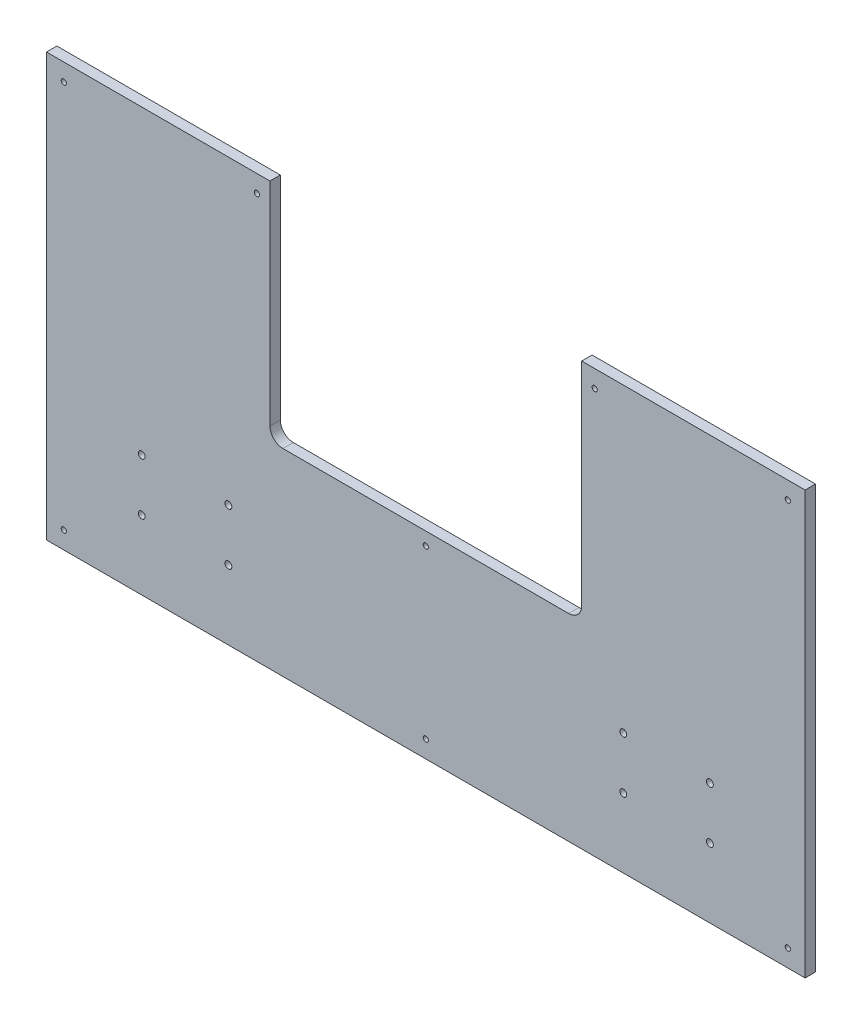
ISO-10303-21;
HEADER;
FILE_DESCRIPTION(('STEP AP214'),'2;1');
FILE_NAME('part.step','',(''),(''),'','','');
FILE_SCHEMA(('AUTOMOTIVE_DESIGN { 1 0 10303 214 1 1 1 1 }'));
ENDSEC;
DATA;
#1=APPLICATION_CONTEXT('core data for automotive mechanical design processes');
#2=APPLICATION_PROTOCOL_DEFINITION('international standard','automotive_design',2000,#1);
#3=PRODUCT_CONTEXT('',#1,'mechanical');
#4=PRODUCT('Part','Part','',(#3));
#5=PRODUCT_RELATED_PRODUCT_CATEGORY('part','',(#4));
#6=PRODUCT_DEFINITION_FORMATION('','',#4);
#7=PRODUCT_DEFINITION_CONTEXT('part definition',#1,'design');
#8=PRODUCT_DEFINITION('design','',#6,#7);
#9=PRODUCT_DEFINITION_SHAPE('','',#8);
#10=(LENGTH_UNIT() NAMED_UNIT(*) SI_UNIT(.MILLI.,.METRE.));
#11=(NAMED_UNIT(*) PLANE_ANGLE_UNIT() SI_UNIT($,.RADIAN.));
#12=(NAMED_UNIT(*) SI_UNIT($,.STERADIAN.) SOLID_ANGLE_UNIT());
#13=UNCERTAINTY_MEASURE_WITH_UNIT(LENGTH_MEASURE(1.E-05),#10,'distance_accuracy_value','');
#14=(GEOMETRIC_REPRESENTATION_CONTEXT(3) GLOBAL_UNCERTAINTY_ASSIGNED_CONTEXT((#13)) GLOBAL_UNIT_ASSIGNED_CONTEXT((#10,
#11,#12)) REPRESENTATION_CONTEXT('',''));
#15=CARTESIAN_POINT('',(0.,0.,0.));
#16=DIRECTION('',(0.,0.,1.));
#17=DIRECTION('',(1.,0.,0.));
#18=AXIS2_PLACEMENT_3D('',#15,#16,#17);
#19=CARTESIAN_POINT('',(136.5,121.5,6.));
#20=DIRECTION('',(0.,0.,1.));
#21=DIRECTION('',(1.,0.,0.));
#22=AXIS2_PLACEMENT_3D('',#19,#20,#21);
#23=PLANE('',#22);
#24=CARTESIAN_POINT('',(55.,40.,6.));
#25=DIRECTION('',(0.,0.,1.));
#26=DIRECTION('',(1.,0.,0.));
#27=AXIS2_PLACEMENT_3D('',#24,#25,#26);
#28=CIRCLE('',#27,2.);
#29=CARTESIAN_POINT('',(57.,40.,6.));
#30=VERTEX_POINT('',#29);
#31=EDGE_CURVE('E353',#30,#30,#28,.T.);
#32=ORIENTED_EDGE('',*,*,#31,.F.);
#33=EDGE_LOOP('',(#32));
#34=FACE_BOUND('',#33,.T.);
#35=CARTESIAN_POINT('',(55.,70.,6.));
#36=DIRECTION('',(0.,0.,1.));
#37=DIRECTION('',(1.,0.,0.));
#38=AXIS2_PLACEMENT_3D('',#35,#36,#37);
#39=CIRCLE('',#38,2.);
#40=CARTESIAN_POINT('',(57.,70.,6.));
#41=VERTEX_POINT('',#40);
#42=EDGE_CURVE('E337',#41,#41,#39,.T.);
#43=ORIENTED_EDGE('',*,*,#42,.F.);
#44=EDGE_LOOP('',(#43));
#45=FACE_BOUND('',#44,.T.);
#46=CARTESIAN_POINT('',(383.,40.,6.));
#47=DIRECTION('',(0.,0.,1.));
#48=DIRECTION('',(1.,0.,0.));
#49=AXIS2_PLACEMENT_3D('',#46,#47,#48);
#50=CIRCLE('',#49,2.);
#51=CARTESIAN_POINT('',(385.,40.,6.));
#52=VERTEX_POINT('',#51);
#53=EDGE_CURVE('E321',#52,#52,#50,.T.);
#54=ORIENTED_EDGE('',*,*,#53,.F.);
#55=EDGE_LOOP('',(#54));
#56=FACE_BOUND('',#55,.T.);
#57=CARTESIAN_POINT('',(219.,106.5,6.));
#58=DIRECTION('',(0.,0.,1.));
#59=DIRECTION('',(1.,0.,0.));
#60=AXIS2_PLACEMENT_3D('',#57,#58,#59);
#61=CIRCLE('',#60,1.5);
#62=CARTESIAN_POINT('',(220.5,106.5,6.));
#63=VERTEX_POINT('',#62);
#64=EDGE_CURVE('E305',#63,#63,#61,.T.);
#65=ORIENTED_EDGE('',*,*,#64,.F.);
#66=EDGE_LOOP('',(#65));
#67=FACE_BOUND('',#66,.T.);
#68=CARTESIAN_POINT('',(428.,234.,6.));
#69=DIRECTION('',(0.,0.,1.));
#70=DIRECTION('',(1.,0.,0.));
#71=AXIS2_PLACEMENT_3D('',#68,#69,#70);
#72=CIRCLE('',#71,1.50000000000002);
#73=CARTESIAN_POINT('',(429.5,234.,6.));
#74=VERTEX_POINT('',#73);
#75=EDGE_CURVE('E289',#74,#74,#72,.T.);
#76=ORIENTED_EDGE('',*,*,#75,.F.);
#77=EDGE_LOOP('',(#76));
#78=FACE_BOUND('',#77,.T.);
#79=CARTESIAN_POINT('',(383.,70.,6.));
#80=DIRECTION('',(0.,0.,1.));
#81=DIRECTION('',(1.,0.,0.));
#82=AXIS2_PLACEMENT_3D('',#79,#80,#81);
#83=CIRCLE('',#82,2.);
#84=CARTESIAN_POINT('',(385.,70.,6.));
#85=VERTEX_POINT('',#84);
#86=EDGE_CURVE('E273',#85,#85,#83,.T.);
#87=ORIENTED_EDGE('',*,*,#86,.F.);
#88=EDGE_LOOP('',(#87));
#89=FACE_BOUND('',#88,.T.);
#90=CARTESIAN_POINT('',(121.5,234.,6.));
#91=DIRECTION('',(0.,0.,1.));
#92=DIRECTION('',(1.,0.,0.));
#93=AXIS2_PLACEMENT_3D('',#90,#91,#92);
#94=CIRCLE('',#93,1.5);
#95=CARTESIAN_POINT('',(123.,234.,6.));
#96=VERTEX_POINT('',#95);
#97=EDGE_CURVE('E257',#96,#96,#94,.T.);
#98=ORIENTED_EDGE('',*,*,#97,.F.);
#99=EDGE_LOOP('',(#98));
#100=FACE_BOUND('',#99,.T.);
#101=CARTESIAN_POINT('',(10.,10.,6.));
#102=DIRECTION('',(0.,0.,1.));
#103=DIRECTION('',(1.,0.,0.));
#104=AXIS2_PLACEMENT_3D('',#101,#102,#103);
#105=CIRCLE('',#104,1.5);
#106=CARTESIAN_POINT('',(11.5,10.,6.));
#107=VERTEX_POINT('',#106);
#108=EDGE_CURVE('E158',#107,#107,#105,.T.);
#109=ORIENTED_EDGE('',*,*,#108,.F.);
#110=EDGE_LOOP('',(#109));
#111=FACE_BOUND('',#110,.T.);
#112=DIRECTION('',(0.,-1.,0.));
#113=VECTOR('',#112,1.);
#114=CARTESIAN_POINT('',(0.,0.,6.));
#115=LINE('',#114,#113);
#116=CARTESIAN_POINT('',(0.,244.,6.));
#117=VERTEX_POINT('',#116);
#118=CARTESIAN_POINT('',(0.,0.,6.));
#119=VERTEX_POINT('',#118);
#120=EDGE_CURVE('E182',#117,#119,#115,.T.);
#121=ORIENTED_EDGE('',*,*,#120,.T.);
#122=DIRECTION('',(1.,0.,0.));
#123=VECTOR('',#122,1.);
#124=CARTESIAN_POINT('',(0.,0.,6.));
#125=LINE('',#124,#123);
#126=CARTESIAN_POINT('',(438.,0.,6.));
#127=VERTEX_POINT('',#126);
#128=EDGE_CURVE('E106',#119,#127,#125,.T.);
#129=ORIENTED_EDGE('',*,*,#128,.T.);
#130=DIRECTION('',(0.,1.,0.));
#131=VECTOR('',#130,1.);
#132=CARTESIAN_POINT('',(438.,0.,6.));
#133=LINE('',#132,#131);
#134=CARTESIAN_POINT('',(438.,244.,6.));
#135=VERTEX_POINT('',#134);
#136=EDGE_CURVE('E211',#127,#135,#133,.T.);
#137=ORIENTED_EDGE('',*,*,#136,.T.);
#138=DIRECTION('',(-1.,0.,0.));
#139=VECTOR('',#138,1.);
#140=CARTESIAN_POINT('',(309.,244.,6.));
#141=LINE('',#140,#139);
#142=CARTESIAN_POINT('',(309.,244.,6.));
#143=VERTEX_POINT('',#142);
#144=EDGE_CURVE('E231',#135,#143,#141,.T.);
#145=ORIENTED_EDGE('',*,*,#144,.T.);
#146=DIRECTION('',(0.,-1.,0.));
#147=VECTOR('',#146,1.);
#148=CARTESIAN_POINT('',(309.,121.5,6.));
#149=LINE('',#148,#147);
#150=CARTESIAN_POINT('',(309.,121.5,6.));
#151=VERTEX_POINT('',#150);
#152=EDGE_CURVE('E227',#143,#151,#149,.T.);
#153=ORIENTED_EDGE('',*,*,#152,.T.);
#154=CARTESIAN_POINT('',(301.5,121.5,6.));
#155=DIRECTION('',(0.,0.,-1.));
#156=DIRECTION('',(1.,0.,0.));
#157=AXIS2_PLACEMENT_3D('',#154,#155,#156);
#158=CIRCLE('',#157,7.5);
#159=CARTESIAN_POINT('',(301.5,114.,6.));
#160=VERTEX_POINT('',#159);
#161=EDGE_CURVE('E230',#151,#160,#158,.T.);
#162=ORIENTED_EDGE('',*,*,#161,.T.);
#163=DIRECTION('',(-1.,0.,0.));
#164=VECTOR('',#163,1.);
#165=CARTESIAN_POINT('',(136.5,114.,6.));
#166=LINE('',#165,#164);
#167=CARTESIAN_POINT('',(136.5,114.,6.));
#168=VERTEX_POINT('',#167);
#169=EDGE_CURVE('E131',#160,#168,#166,.T.);
#170=ORIENTED_EDGE('',*,*,#169,.T.);
#171=CARTESIAN_POINT('',(136.5,121.5,6.));
#172=DIRECTION('',(0.,0.,-1.));
#173=DIRECTION('',(1.,0.,0.));
#174=AXIS2_PLACEMENT_3D('',#171,#172,#173);
#175=CIRCLE('',#174,7.50000000000001);
#176=CARTESIAN_POINT('',(129.,121.5,6.));
#177=VERTEX_POINT('',#176);
#178=EDGE_CURVE('E125',#168,#177,#175,.T.);
#179=ORIENTED_EDGE('',*,*,#178,.T.);
#180=DIRECTION('',(0.,1.,0.));
#181=VECTOR('',#180,1.);
#182=CARTESIAN_POINT('',(129.,244.,6.));
#183=LINE('',#182,#181);
#184=CARTESIAN_POINT('',(129.,244.,6.));
#185=VERTEX_POINT('',#184);
#186=EDGE_CURVE('E129',#177,#185,#183,.T.);
#187=ORIENTED_EDGE('',*,*,#186,.T.);
#188=DIRECTION('',(-1.,0.,0.));
#189=VECTOR('',#188,1.);
#190=CARTESIAN_POINT('',(0.,244.,6.));
#191=LINE('',#190,#189);
#192=EDGE_CURVE('E57',#185,#117,#191,.T.);
#193=ORIENTED_EDGE('',*,*,#192,.T.);
#194=EDGE_LOOP('',(#121,#129,#137,#145,#153,#162,#170,#179,#187,#193));
#195=FACE_BOUND('',#194,.T.);
#196=CARTESIAN_POINT('',(10.,234.,6.));
#197=DIRECTION('',(0.,0.,1.));
#198=DIRECTION('',(1.,0.,0.));
#199=AXIS2_PLACEMENT_3D('',#196,#197,#198);
#200=CIRCLE('',#199,1.5);
#201=CARTESIAN_POINT('',(11.5,234.,6.));
#202=VERTEX_POINT('',#201);
#203=EDGE_CURVE('E249',#202,#202,#200,.T.);
#204=ORIENTED_EDGE('',*,*,#203,.F.);
#205=EDGE_LOOP('',(#204));
#206=FACE_BOUND('',#205,.T.);
#207=CARTESIAN_POINT('',(333.,70.,6.));
#208=DIRECTION('',(0.,0.,1.));
#209=DIRECTION('',(1.,0.,0.));
#210=AXIS2_PLACEMENT_3D('',#207,#208,#209);
#211=CIRCLE('',#210,2.);
#212=CARTESIAN_POINT('',(335.,70.,6.));
#213=VERTEX_POINT('',#212);
#214=EDGE_CURVE('E265',#213,#213,#211,.T.);
#215=ORIENTED_EDGE('',*,*,#214,.F.);
#216=EDGE_LOOP('',(#215));
#217=FACE_BOUND('',#216,.T.);
#218=CARTESIAN_POINT('',(316.5,234.,6.));
#219=DIRECTION('',(0.,0.,1.));
#220=DIRECTION('',(1.,0.,0.));
#221=AXIS2_PLACEMENT_3D('',#218,#219,#220);
#222=CIRCLE('',#221,1.50000000000002);
#223=CARTESIAN_POINT('',(318.,234.,6.));
#224=VERTEX_POINT('',#223);
#225=EDGE_CURVE('E281',#224,#224,#222,.T.);
#226=ORIENTED_EDGE('',*,*,#225,.F.);
#227=EDGE_LOOP('',(#226));
#228=FACE_BOUND('',#227,.T.);
#229=CARTESIAN_POINT('',(428.,10.,6.));
#230=DIRECTION('',(0.,0.,1.));
#231=DIRECTION('',(1.,0.,0.));
#232=AXIS2_PLACEMENT_3D('',#229,#230,#231);
#233=CIRCLE('',#232,1.50000000000002);
#234=CARTESIAN_POINT('',(429.5,10.,6.));
#235=VERTEX_POINT('',#234);
#236=EDGE_CURVE('E297',#235,#235,#233,.T.);
#237=ORIENTED_EDGE('',*,*,#236,.F.);
#238=EDGE_LOOP('',(#237));
#239=FACE_BOUND('',#238,.T.);
#240=CARTESIAN_POINT('',(219.,10.,6.));
#241=DIRECTION('',(0.,0.,1.));
#242=DIRECTION('',(1.,0.,0.));
#243=AXIS2_PLACEMENT_3D('',#240,#241,#242);
#244=CIRCLE('',#243,1.5);
#245=CARTESIAN_POINT('',(220.5,10.,6.));
#246=VERTEX_POINT('',#245);
#247=EDGE_CURVE('E313',#246,#246,#244,.T.);
#248=ORIENTED_EDGE('',*,*,#247,.F.);
#249=EDGE_LOOP('',(#248));
#250=FACE_BOUND('',#249,.T.);
#251=CARTESIAN_POINT('',(333.,40.,6.));
#252=DIRECTION('',(0.,0.,1.));
#253=DIRECTION('',(1.,0.,0.));
#254=AXIS2_PLACEMENT_3D('',#251,#252,#253);
#255=CIRCLE('',#254,2.);
#256=CARTESIAN_POINT('',(335.,40.,6.));
#257=VERTEX_POINT('',#256);
#258=EDGE_CURVE('E329',#257,#257,#255,.T.);
#259=ORIENTED_EDGE('',*,*,#258,.F.);
#260=EDGE_LOOP('',(#259));
#261=FACE_BOUND('',#260,.T.);
#262=CARTESIAN_POINT('',(105.,70.,6.));
#263=DIRECTION('',(0.,0.,1.));
#264=DIRECTION('',(1.,0.,0.));
#265=AXIS2_PLACEMENT_3D('',#262,#263,#264);
#266=CIRCLE('',#265,2.);
#267=CARTESIAN_POINT('',(107.,70.,6.));
#268=VERTEX_POINT('',#267);
#269=EDGE_CURVE('E345',#268,#268,#266,.T.);
#270=ORIENTED_EDGE('',*,*,#269,.F.);
#271=EDGE_LOOP('',(#270));
#272=FACE_BOUND('',#271,.T.);
#273=CARTESIAN_POINT('',(105.,40.,6.));
#274=DIRECTION('',(0.,0.,1.));
#275=DIRECTION('',(1.,0.,0.));
#276=AXIS2_PLACEMENT_3D('',#273,#274,#275);
#277=CIRCLE('',#276,1.99999999999998);
#278=CARTESIAN_POINT('',(107.,40.,6.));
#279=VERTEX_POINT('',#278);
#280=EDGE_CURVE('E361',#279,#279,#277,.T.);
#281=ORIENTED_EDGE('',*,*,#280,.F.);
#282=EDGE_LOOP('',(#281));
#283=FACE_BOUND('',#282,.T.);
#284=ADVANCED_FACE('F39',(#34,#45,#56,#67,#78,#89,#100,#111,#195,#206,#217,#228,#239,#250,#261,
#272,#283),#23,.T.);
#285=CARTESIAN_POINT('',(136.5,121.5,0.));
#286=DIRECTION('',(0.,0.,1.));
#287=DIRECTION('',(1.,0.,0.));
#288=AXIS2_PLACEMENT_3D('',#285,#286,#287);
#289=PLANE('',#288);
#290=DIRECTION('',(0.,-1.,0.));
#291=VECTOR('',#290,1.);
#292=CARTESIAN_POINT('',(0.,0.,0.));
#293=LINE('',#292,#291);
#294=CARTESIAN_POINT('',(0.,244.,0.));
#295=VERTEX_POINT('',#294);
#296=CARTESIAN_POINT('',(0.,0.,0.));
#297=VERTEX_POINT('',#296);
#298=EDGE_CURVE('E153',#295,#297,#293,.T.);
#299=ORIENTED_EDGE('',*,*,#298,.F.);
#300=DIRECTION('',(-1.,0.,0.));
#301=VECTOR('',#300,1.);
#302=CARTESIAN_POINT('',(0.,244.,0.));
#303=LINE('',#302,#301);
#304=CARTESIAN_POINT('',(129.,244.,0.));
#305=VERTEX_POINT('',#304);
#306=EDGE_CURVE('E98',#305,#295,#303,.T.);
#307=ORIENTED_EDGE('',*,*,#306,.F.);
#308=DIRECTION('',(0.,1.,0.));
#309=VECTOR('',#308,1.);
#310=CARTESIAN_POINT('',(129.,244.,0.));
#311=LINE('',#310,#309);
#312=CARTESIAN_POINT('',(129.,121.5,0.));
#313=VERTEX_POINT('',#312);
#314=EDGE_CURVE('E92',#313,#305,#311,.T.);
#315=ORIENTED_EDGE('',*,*,#314,.F.);
#316=CARTESIAN_POINT('',(136.5,121.5,0.));
#317=DIRECTION('',(0.,0.,-1.));
#318=DIRECTION('',(1.,0.,0.));
#319=AXIS2_PLACEMENT_3D('',#316,#317,#318);
#320=CIRCLE('',#319,7.50000000000001);
#321=CARTESIAN_POINT('',(136.5,114.,0.));
#322=VERTEX_POINT('',#321);
#323=EDGE_CURVE('E140',#322,#313,#320,.T.);
#324=ORIENTED_EDGE('',*,*,#323,.F.);
#325=DIRECTION('',(-1.,0.,0.));
#326=VECTOR('',#325,1.);
#327=CARTESIAN_POINT('',(136.5,114.,0.));
#328=LINE('',#327,#326);
#329=CARTESIAN_POINT('',(301.5,114.,0.));
#330=VERTEX_POINT('',#329);
#331=EDGE_CURVE('E173',#330,#322,#328,.T.);
#332=ORIENTED_EDGE('',*,*,#331,.F.);
#333=CARTESIAN_POINT('',(301.5,121.5,0.));
#334=DIRECTION('',(0.,0.,-1.));
#335=DIRECTION('',(1.,0.,0.));
#336=AXIS2_PLACEMENT_3D('',#333,#334,#335);
#337=CIRCLE('',#336,7.5);
#338=CARTESIAN_POINT('',(309.,121.5,0.));
#339=VERTEX_POINT('',#338);
#340=EDGE_CURVE('E170',#339,#330,#337,.T.);
#341=ORIENTED_EDGE('',*,*,#340,.F.);
#342=DIRECTION('',(0.,-1.,0.));
#343=VECTOR('',#342,1.);
#344=CARTESIAN_POINT('',(309.,121.5,0.));
#345=LINE('',#344,#343);
#346=CARTESIAN_POINT('',(309.,244.,0.));
#347=VERTEX_POINT('',#346);
#348=EDGE_CURVE('E167',#347,#339,#345,.T.);
#349=ORIENTED_EDGE('',*,*,#348,.F.);
#350=DIRECTION('',(-1.,0.,0.));
#351=VECTOR('',#350,1.);
#352=CARTESIAN_POINT('',(309.,244.,0.));
#353=LINE('',#352,#351);
#354=CARTESIAN_POINT('',(438.,244.,0.));
#355=VERTEX_POINT('',#354);
#356=EDGE_CURVE('E164',#355,#347,#353,.T.);
#357=ORIENTED_EDGE('',*,*,#356,.F.);
#358=DIRECTION('',(0.,1.,0.));
#359=VECTOR('',#358,1.);
#360=CARTESIAN_POINT('',(438.,0.,0.));
#361=LINE('',#360,#359);
#362=CARTESIAN_POINT('',(438.,0.,0.));
#363=VERTEX_POINT('',#362);
#364=EDGE_CURVE('E161',#363,#355,#361,.T.);
#365=ORIENTED_EDGE('',*,*,#364,.F.);
#366=DIRECTION('',(1.,0.,0.));
#367=VECTOR('',#366,1.);
#368=CARTESIAN_POINT('',(0.,0.,0.));
#369=LINE('',#368,#367);
#370=EDGE_CURVE('E157',#297,#363,#369,.T.);
#371=ORIENTED_EDGE('',*,*,#370,.F.);
#372=EDGE_LOOP('',(#299,#307,#315,#324,#332,#341,#349,#357,#365,#371));
#373=FACE_BOUND('',#372,.T.);
#374=CARTESIAN_POINT('',(10.,10.,0.));
#375=DIRECTION('',(0.,0.,1.));
#376=DIRECTION('',(1.,0.,0.));
#377=AXIS2_PLACEMENT_3D('',#374,#375,#376);
#378=CIRCLE('',#377,1.5);
#379=CARTESIAN_POINT('',(11.5,10.,0.));
#380=VERTEX_POINT('',#379);
#381=EDGE_CURVE('E245',#380,#380,#378,.T.);
#382=ORIENTED_EDGE('',*,*,#381,.T.);
#383=EDGE_LOOP('',(#382));
#384=FACE_BOUND('',#383,.T.);
#385=CARTESIAN_POINT('',(10.,234.,0.));
#386=DIRECTION('',(0.,0.,1.));
#387=DIRECTION('',(1.,0.,0.));
#388=AXIS2_PLACEMENT_3D('',#385,#386,#387);
#389=CIRCLE('',#388,1.5);
#390=CARTESIAN_POINT('',(11.5,234.,0.));
#391=VERTEX_POINT('',#390);
#392=EDGE_CURVE('E253',#391,#391,#389,.T.);
#393=ORIENTED_EDGE('',*,*,#392,.T.);
#394=EDGE_LOOP('',(#393));
#395=FACE_BOUND('',#394,.T.);
#396=CARTESIAN_POINT('',(121.5,234.,0.));
#397=DIRECTION('',(0.,0.,1.));
#398=DIRECTION('',(1.,0.,0.));
#399=AXIS2_PLACEMENT_3D('',#396,#397,#398);
#400=CIRCLE('',#399,1.5);
#401=CARTESIAN_POINT('',(123.,234.,0.));
#402=VERTEX_POINT('',#401);
#403=EDGE_CURVE('E261',#402,#402,#400,.T.);
#404=ORIENTED_EDGE('',*,*,#403,.T.);
#405=EDGE_LOOP('',(#404));
#406=FACE_BOUND('',#405,.T.);
#407=CARTESIAN_POINT('',(333.,70.,0.));
#408=DIRECTION('',(0.,0.,1.));
#409=DIRECTION('',(1.,0.,0.));
#410=AXIS2_PLACEMENT_3D('',#407,#408,#409);
#411=CIRCLE('',#410,2.);
#412=CARTESIAN_POINT('',(335.,70.,0.));
#413=VERTEX_POINT('',#412);
#414=EDGE_CURVE('E269',#413,#413,#411,.T.);
#415=ORIENTED_EDGE('',*,*,#414,.T.);
#416=EDGE_LOOP('',(#415));
#417=FACE_BOUND('',#416,.T.);
#418=CARTESIAN_POINT('',(383.,70.,0.));
#419=DIRECTION('',(0.,0.,1.));
#420=DIRECTION('',(1.,0.,0.));
#421=AXIS2_PLACEMENT_3D('',#418,#419,#420);
#422=CIRCLE('',#421,2.);
#423=CARTESIAN_POINT('',(385.,70.,0.));
#424=VERTEX_POINT('',#423);
#425=EDGE_CURVE('E277',#424,#424,#422,.T.);
#426=ORIENTED_EDGE('',*,*,#425,.T.);
#427=EDGE_LOOP('',(#426));
#428=FACE_BOUND('',#427,.T.);
#429=CARTESIAN_POINT('',(316.5,234.,0.));
#430=DIRECTION('',(0.,0.,1.));
#431=DIRECTION('',(1.,0.,0.));
#432=AXIS2_PLACEMENT_3D('',#429,#430,#431);
#433=CIRCLE('',#432,1.50000000000002);
#434=CARTESIAN_POINT('',(318.,234.,0.));
#435=VERTEX_POINT('',#434);
#436=EDGE_CURVE('E285',#435,#435,#433,.T.);
#437=ORIENTED_EDGE('',*,*,#436,.T.);
#438=EDGE_LOOP('',(#437));
#439=FACE_BOUND('',#438,.T.);
#440=CARTESIAN_POINT('',(428.,234.,0.));
#441=DIRECTION('',(0.,0.,1.));
#442=DIRECTION('',(1.,0.,0.));
#443=AXIS2_PLACEMENT_3D('',#440,#441,#442);
#444=CIRCLE('',#443,1.50000000000002);
#445=CARTESIAN_POINT('',(429.5,234.,0.));
#446=VERTEX_POINT('',#445);
#447=EDGE_CURVE('E293',#446,#446,#444,.T.);
#448=ORIENTED_EDGE('',*,*,#447,.T.);
#449=EDGE_LOOP('',(#448));
#450=FACE_BOUND('',#449,.T.);
#451=CARTESIAN_POINT('',(428.,10.,0.));
#452=DIRECTION('',(0.,0.,1.));
#453=DIRECTION('',(1.,0.,0.));
#454=AXIS2_PLACEMENT_3D('',#451,#452,#453);
#455=CIRCLE('',#454,1.50000000000002);
#456=CARTESIAN_POINT('',(429.5,10.,0.));
#457=VERTEX_POINT('',#456);
#458=EDGE_CURVE('E301',#457,#457,#455,.T.);
#459=ORIENTED_EDGE('',*,*,#458,.T.);
#460=EDGE_LOOP('',(#459));
#461=FACE_BOUND('',#460,.T.);
#462=CARTESIAN_POINT('',(219.,106.5,0.));
#463=DIRECTION('',(0.,0.,1.));
#464=DIRECTION('',(1.,0.,0.));
#465=AXIS2_PLACEMENT_3D('',#462,#463,#464);
#466=CIRCLE('',#465,1.5);
#467=CARTESIAN_POINT('',(220.5,106.5,0.));
#468=VERTEX_POINT('',#467);
#469=EDGE_CURVE('E309',#468,#468,#466,.T.);
#470=ORIENTED_EDGE('',*,*,#469,.T.);
#471=EDGE_LOOP('',(#470));
#472=FACE_BOUND('',#471,.T.);
#473=CARTESIAN_POINT('',(219.,10.,0.));
#474=DIRECTION('',(0.,0.,1.));
#475=DIRECTION('',(1.,0.,0.));
#476=AXIS2_PLACEMENT_3D('',#473,#474,#475);
#477=CIRCLE('',#476,1.5);
#478=CARTESIAN_POINT('',(220.5,10.,0.));
#479=VERTEX_POINT('',#478);
#480=EDGE_CURVE('E317',#479,#479,#477,.T.);
#481=ORIENTED_EDGE('',*,*,#480,.T.);
#482=EDGE_LOOP('',(#481));
#483=FACE_BOUND('',#482,.T.);
#484=CARTESIAN_POINT('',(383.,40.,0.));
#485=DIRECTION('',(0.,0.,1.));
#486=DIRECTION('',(1.,0.,0.));
#487=AXIS2_PLACEMENT_3D('',#484,#485,#486);
#488=CIRCLE('',#487,2.);
#489=CARTESIAN_POINT('',(385.,40.,0.));
#490=VERTEX_POINT('',#489);
#491=EDGE_CURVE('E325',#490,#490,#488,.T.);
#492=ORIENTED_EDGE('',*,*,#491,.T.);
#493=EDGE_LOOP('',(#492));
#494=FACE_BOUND('',#493,.T.);
#495=CARTESIAN_POINT('',(333.,40.,0.));
#496=DIRECTION('',(0.,0.,1.));
#497=DIRECTION('',(1.,0.,0.));
#498=AXIS2_PLACEMENT_3D('',#495,#496,#497);
#499=CIRCLE('',#498,2.);
#500=CARTESIAN_POINT('',(335.,40.,0.));
#501=VERTEX_POINT('',#500);
#502=EDGE_CURVE('E333',#501,#501,#499,.T.);
#503=ORIENTED_EDGE('',*,*,#502,.T.);
#504=EDGE_LOOP('',(#503));
#505=FACE_BOUND('',#504,.T.);
#506=CARTESIAN_POINT('',(55.,70.,0.));
#507=DIRECTION('',(0.,0.,1.));
#508=DIRECTION('',(1.,0.,0.));
#509=AXIS2_PLACEMENT_3D('',#506,#507,#508);
#510=CIRCLE('',#509,2.);
#511=CARTESIAN_POINT('',(57.,70.,0.));
#512=VERTEX_POINT('',#511);
#513=EDGE_CURVE('E341',#512,#512,#510,.T.);
#514=ORIENTED_EDGE('',*,*,#513,.T.);
#515=EDGE_LOOP('',(#514));
#516=FACE_BOUND('',#515,.T.);
#517=CARTESIAN_POINT('',(105.,70.,0.));
#518=DIRECTION('',(0.,0.,1.));
#519=DIRECTION('',(1.,0.,0.));
#520=AXIS2_PLACEMENT_3D('',#517,#518,#519);
#521=CIRCLE('',#520,2.);
#522=CARTESIAN_POINT('',(107.,70.,0.));
#523=VERTEX_POINT('',#522);
#524=EDGE_CURVE('E349',#523,#523,#521,.T.);
#525=ORIENTED_EDGE('',*,*,#524,.T.);
#526=EDGE_LOOP('',(#525));
#527=FACE_BOUND('',#526,.T.);
#528=CARTESIAN_POINT('',(55.,40.,0.));
#529=DIRECTION('',(0.,0.,1.));
#530=DIRECTION('',(1.,0.,0.));
#531=AXIS2_PLACEMENT_3D('',#528,#529,#530);
#532=CIRCLE('',#531,2.);
#533=CARTESIAN_POINT('',(57.,40.,0.));
#534=VERTEX_POINT('',#533);
#535=EDGE_CURVE('E357',#534,#534,#532,.T.);
#536=ORIENTED_EDGE('',*,*,#535,.T.);
#537=EDGE_LOOP('',(#536));
#538=FACE_BOUND('',#537,.T.);
#539=CARTESIAN_POINT('',(105.,40.,0.));
#540=DIRECTION('',(0.,0.,1.));
#541=DIRECTION('',(1.,0.,0.));
#542=AXIS2_PLACEMENT_3D('',#539,#540,#541);
#543=CIRCLE('',#542,1.99999999999998);
#544=CARTESIAN_POINT('',(107.,40.,0.));
#545=VERTEX_POINT('',#544);
#546=EDGE_CURVE('E365',#545,#545,#543,.T.);
#547=ORIENTED_EDGE('',*,*,#546,.T.);
#548=EDGE_LOOP('',(#547));
#549=FACE_BOUND('',#548,.T.);
#550=ADVANCED_FACE('F215',(#373,#384,#395,#406,#417,#428,#439,#450,#461,#472,#483,#494,#505,
#516,#527,#538,#549),#289,.F.);
#551=CARTESIAN_POINT('',(0.,0.,6.));
#552=DIRECTION('',(1.,0.,0.));
#553=DIRECTION('',(0.,0.,-1.));
#554=AXIS2_PLACEMENT_3D('',#551,#552,#553);
#555=PLANE('',#554);
#556=ORIENTED_EDGE('',*,*,#298,.T.);
#557=DIRECTION('',(0.,0.,-1.));
#558=VECTOR('',#557,1.);
#559=CARTESIAN_POINT('',(0.,0.,6.));
#560=LINE('',#559,#558);
#561=EDGE_CURVE('E11',#119,#297,#560,.T.);
#562=ORIENTED_EDGE('',*,*,#561,.F.);
#563=ORIENTED_EDGE('',*,*,#120,.F.);
#564=DIRECTION('',(0.,0.,-1.));
#565=VECTOR('',#564,1.);
#566=CARTESIAN_POINT('',(0.,244.,6.));
#567=LINE('',#566,#565);
#568=EDGE_CURVE('E149',#117,#295,#567,.T.);
#569=ORIENTED_EDGE('',*,*,#568,.T.);
#570=EDGE_LOOP('',(#556,#562,#563,#569));
#571=FACE_BOUND('',#570,.T.);
#572=ADVANCED_FACE('F41',(#571),#555,.F.);
#573=CARTESIAN_POINT('',(0.,0.,6.));
#574=DIRECTION('',(0.,1.,0.));
#575=DIRECTION('',(0.,0.,1.));
#576=AXIS2_PLACEMENT_3D('',#573,#574,#575);
#577=PLANE('',#576);
#578=ORIENTED_EDGE('',*,*,#370,.T.);
#579=DIRECTION('',(0.,0.,-1.));
#580=VECTOR('',#579,1.);
#581=CARTESIAN_POINT('',(438.,0.,6.));
#582=LINE('',#581,#580);
#583=EDGE_CURVE('E49',#127,#363,#582,.T.);
#584=ORIENTED_EDGE('',*,*,#583,.F.);
#585=ORIENTED_EDGE('',*,*,#128,.F.);
#586=ORIENTED_EDGE('',*,*,#561,.T.);
#587=EDGE_LOOP('',(#578,#584,#585,#586));
#588=FACE_BOUND('',#587,.T.);
#589=ADVANCED_FACE('F409',(#588),#577,.F.);
#590=CARTESIAN_POINT('',(438.,0.,6.));
#591=DIRECTION('',(-1.,0.,0.));
#592=DIRECTION('',(0.,0.,1.));
#593=AXIS2_PLACEMENT_3D('',#590,#591,#592);
#594=PLANE('',#593);
#595=ORIENTED_EDGE('',*,*,#364,.T.);
#596=DIRECTION('',(0.,0.,-1.));
#597=VECTOR('',#596,1.);
#598=CARTESIAN_POINT('',(438.,244.,6.));
#599=LINE('',#598,#597);
#600=EDGE_CURVE('E201',#135,#355,#599,.T.);
#601=ORIENTED_EDGE('',*,*,#600,.F.);
#602=ORIENTED_EDGE('',*,*,#136,.F.);
#603=ORIENTED_EDGE('',*,*,#583,.T.);
#604=EDGE_LOOP('',(#595,#601,#602,#603));
#605=FACE_BOUND('',#604,.T.);
#606=ADVANCED_FACE('F209',(#605),#594,.F.);
#607=CARTESIAN_POINT('',(309.,244.,6.));
#608=DIRECTION('',(0.,-1.,0.));
#609=DIRECTION('',(1.,0.,0.));
#610=AXIS2_PLACEMENT_3D('',#607,#608,#609);
#611=PLANE('',#610);
#612=ORIENTED_EDGE('',*,*,#356,.T.);
#613=DIRECTION('',(0.,0.,-1.));
#614=VECTOR('',#613,1.);
#615=CARTESIAN_POINT('',(309.,244.,6.));
#616=LINE('',#615,#614);
#617=EDGE_CURVE('E197',#143,#347,#616,.T.);
#618=ORIENTED_EDGE('',*,*,#617,.F.);
#619=ORIENTED_EDGE('',*,*,#144,.F.);
#620=ORIENTED_EDGE('',*,*,#600,.T.);
#621=EDGE_LOOP('',(#612,#618,#619,#620));
#622=FACE_BOUND('',#621,.T.);
#623=ADVANCED_FACE('F221',(#622),#611,.F.);
#624=CARTESIAN_POINT('',(309.,121.5,6.));
#625=DIRECTION('',(1.,0.,0.));
#626=DIRECTION('',(0.,0.,-1.));
#627=AXIS2_PLACEMENT_3D('',#624,#625,#626);
#628=PLANE('',#627);
#629=ORIENTED_EDGE('',*,*,#348,.T.);
#630=DIRECTION('',(0.,0.,-1.));
#631=VECTOR('',#630,1.);
#632=CARTESIAN_POINT('',(309.,121.5,6.));
#633=LINE('',#632,#631);
#634=EDGE_CURVE('E193',#151,#339,#633,.T.);
#635=ORIENTED_EDGE('',*,*,#634,.F.);
#636=ORIENTED_EDGE('',*,*,#152,.F.);
#637=ORIENTED_EDGE('',*,*,#617,.T.);
#638=EDGE_LOOP('',(#629,#635,#636,#637));
#639=FACE_BOUND('',#638,.T.);
#640=ADVANCED_FACE('F225',(#639),#628,.F.);
#641=CARTESIAN_POINT('',(301.5,121.5,6.));
#642=DIRECTION('',(0.,0.,-1.));
#643=DIRECTION('',(-1.,0.,0.));
#644=AXIS2_PLACEMENT_3D('',#641,#642,#643);
#645=CYLINDRICAL_SURFACE('',#644,7.5);
#646=ORIENTED_EDGE('',*,*,#340,.T.);
#647=DIRECTION('',(0.,0.,-1.));
#648=VECTOR('',#647,1.);
#649=CARTESIAN_POINT('',(301.5,114.,6.));
#650=LINE('',#649,#648);
#651=EDGE_CURVE('E189',#160,#330,#650,.T.);
#652=ORIENTED_EDGE('',*,*,#651,.F.);
#653=ORIENTED_EDGE('',*,*,#161,.F.);
#654=ORIENTED_EDGE('',*,*,#634,.T.);
#655=EDGE_LOOP('',(#646,#652,#653,#654));
#656=FACE_BOUND('',#655,.T.);
#657=ADVANCED_FACE('F399',(#656),#645,.F.);
#658=CARTESIAN_POINT('',(136.5,114.,6.));
#659=DIRECTION('',(0.,-1.,0.));
#660=DIRECTION('',(1.,0.,0.));
#661=AXIS2_PLACEMENT_3D('',#658,#659,#660);
#662=PLANE('',#661);
#663=ORIENTED_EDGE('',*,*,#331,.T.);
#664=DIRECTION('',(0.,0.,-1.));
#665=VECTOR('',#664,1.);
#666=CARTESIAN_POINT('',(136.5,114.,6.));
#667=LINE('',#666,#665);
#668=EDGE_CURVE('E142',#168,#322,#667,.T.);
#669=ORIENTED_EDGE('',*,*,#668,.F.);
#670=ORIENTED_EDGE('',*,*,#169,.F.);
#671=ORIENTED_EDGE('',*,*,#651,.T.);
#672=EDGE_LOOP('',(#663,#669,#670,#671));
#673=FACE_BOUND('',#672,.T.);
#674=ADVANCED_FACE('F396',(#673),#662,.F.);
#675=CARTESIAN_POINT('',(136.5,121.5,6.));
#676=DIRECTION('',(0.,0.,-1.));
#677=DIRECTION('',(-1.,0.,0.));
#678=AXIS2_PLACEMENT_3D('',#675,#676,#677);
#679=CYLINDRICAL_SURFACE('',#678,7.50000000000001);
#680=ORIENTED_EDGE('',*,*,#323,.T.);
#681=DIRECTION('',(0.,0.,-1.));
#682=VECTOR('',#681,1.);
#683=CARTESIAN_POINT('',(129.,121.5,6.));
#684=LINE('',#683,#682);
#685=EDGE_CURVE('E137',#177,#313,#684,.T.);
#686=ORIENTED_EDGE('',*,*,#685,.F.);
#687=ORIENTED_EDGE('',*,*,#178,.F.);
#688=ORIENTED_EDGE('',*,*,#668,.T.);
#689=EDGE_LOOP('',(#680,#686,#687,#688));
#690=FACE_BOUND('',#689,.T.);
#691=ADVANCED_FACE('F138',(#690),#679,.F.);
#692=CARTESIAN_POINT('',(129.,244.,6.));
#693=DIRECTION('',(-1.,0.,0.));
#694=DIRECTION('',(0.,0.,1.));
#695=AXIS2_PLACEMENT_3D('',#692,#693,#694);
#696=PLANE('',#695);
#697=ORIENTED_EDGE('',*,*,#314,.T.);
#698=DIRECTION('',(0.,0.,-1.));
#699=VECTOR('',#698,1.);
#700=CARTESIAN_POINT('',(129.,244.,6.));
#701=LINE('',#700,#699);
#702=EDGE_CURVE('E143',#185,#305,#701,.T.);
#703=ORIENTED_EDGE('',*,*,#702,.F.);
#704=ORIENTED_EDGE('',*,*,#186,.F.);
#705=ORIENTED_EDGE('',*,*,#685,.T.);
#706=EDGE_LOOP('',(#697,#703,#704,#705));
#707=FACE_BOUND('',#706,.T.);
#708=ADVANCED_FACE('F145',(#707),#696,.F.);
#709=CARTESIAN_POINT('',(0.,244.,6.));
#710=DIRECTION('',(0.,-1.,0.));
#711=DIRECTION('',(0.,0.,-1.));
#712=AXIS2_PLACEMENT_3D('',#709,#710,#711);
#713=PLANE('',#712);
#714=ORIENTED_EDGE('',*,*,#306,.T.);
#715=ORIENTED_EDGE('',*,*,#568,.F.);
#716=ORIENTED_EDGE('',*,*,#192,.F.);
#717=ORIENTED_EDGE('',*,*,#702,.T.);
#718=EDGE_LOOP('',(#714,#715,#716,#717));
#719=FACE_BOUND('',#718,.T.);
#720=ADVANCED_FACE('F389',(#719),#713,.F.);
#721=CARTESIAN_POINT('',(10.,10.,6.));
#722=DIRECTION('',(0.,0.,-1.));
#723=DIRECTION('',(-1.,0.,0.));
#724=AXIS2_PLACEMENT_3D('',#721,#722,#723);
#725=CYLINDRICAL_SURFACE('',#724,1.5);
#726=ORIENTED_EDGE('',*,*,#108,.T.);
#727=EDGE_LOOP('',(#726));
#728=FACE_BOUND('',#727,.T.);
#729=ORIENTED_EDGE('',*,*,#381,.F.);
#730=EDGE_LOOP('',(#729));
#731=FACE_BOUND('',#730,.T.);
#732=ADVANCED_FACE('F386',(#728,#731),#725,.F.);
#733=CARTESIAN_POINT('',(10.,234.,6.));
#734=DIRECTION('',(0.,0.,-1.));
#735=DIRECTION('',(-1.,0.,0.));
#736=AXIS2_PLACEMENT_3D('',#733,#734,#735);
#737=CYLINDRICAL_SURFACE('',#736,1.5);
#738=ORIENTED_EDGE('',*,*,#203,.T.);
#739=EDGE_LOOP('',(#738));
#740=FACE_BOUND('',#739,.T.);
#741=ORIENTED_EDGE('',*,*,#392,.F.);
#742=EDGE_LOOP('',(#741));
#743=FACE_BOUND('',#742,.T.);
#744=ADVANCED_FACE('F485',(#740,#743),#737,.F.);
#745=CARTESIAN_POINT('',(121.5,234.,6.));
#746=DIRECTION('',(0.,0.,-1.));
#747=DIRECTION('',(-1.,0.,0.));
#748=AXIS2_PLACEMENT_3D('',#745,#746,#747);
#749=CYLINDRICAL_SURFACE('',#748,1.5);
#750=ORIENTED_EDGE('',*,*,#97,.T.);
#751=EDGE_LOOP('',(#750));
#752=FACE_BOUND('',#751,.T.);
#753=ORIENTED_EDGE('',*,*,#403,.F.);
#754=EDGE_LOOP('',(#753));
#755=FACE_BOUND('',#754,.T.);
#756=ADVANCED_FACE('F493',(#752,#755),#749,.F.);
#757=CARTESIAN_POINT('',(333.,70.,6.));
#758=DIRECTION('',(0.,0.,-1.));
#759=DIRECTION('',(-1.,0.,0.));
#760=AXIS2_PLACEMENT_3D('',#757,#758,#759);
#761=CYLINDRICAL_SURFACE('',#760,2.);
#762=ORIENTED_EDGE('',*,*,#214,.T.);
#763=EDGE_LOOP('',(#762));
#764=FACE_BOUND('',#763,.T.);
#765=ORIENTED_EDGE('',*,*,#414,.F.);
#766=EDGE_LOOP('',(#765));
#767=FACE_BOUND('',#766,.T.);
#768=ADVANCED_FACE('F501',(#764,#767),#761,.F.);
#769=CARTESIAN_POINT('',(383.,70.,6.));
#770=DIRECTION('',(0.,0.,-1.));
#771=DIRECTION('',(-1.,0.,0.));
#772=AXIS2_PLACEMENT_3D('',#769,#770,#771);
#773=CYLINDRICAL_SURFACE('',#772,2.);
#774=ORIENTED_EDGE('',*,*,#86,.T.);
#775=EDGE_LOOP('',(#774));
#776=FACE_BOUND('',#775,.T.);
#777=ORIENTED_EDGE('',*,*,#425,.F.);
#778=EDGE_LOOP('',(#777));
#779=FACE_BOUND('',#778,.T.);
#780=ADVANCED_FACE('F510',(#776,#779),#773,.F.);
#781=CARTESIAN_POINT('',(316.5,234.,6.));
#782=DIRECTION('',(0.,0.,-1.));
#783=DIRECTION('',(-1.,0.,0.));
#784=AXIS2_PLACEMENT_3D('',#781,#782,#783);
#785=CYLINDRICAL_SURFACE('',#784,1.50000000000002);
#786=ORIENTED_EDGE('',*,*,#225,.T.);
#787=EDGE_LOOP('',(#786));
#788=FACE_BOUND('',#787,.T.);
#789=ORIENTED_EDGE('',*,*,#436,.F.);
#790=EDGE_LOOP('',(#789));
#791=FACE_BOUND('',#790,.T.);
#792=ADVANCED_FACE('F519',(#788,#791),#785,.F.);
#793=CARTESIAN_POINT('',(428.,234.,6.));
#794=DIRECTION('',(0.,0.,-1.));
#795=DIRECTION('',(-1.,0.,0.));
#796=AXIS2_PLACEMENT_3D('',#793,#794,#795);
#797=CYLINDRICAL_SURFACE('',#796,1.50000000000002);
#798=ORIENTED_EDGE('',*,*,#75,.T.);
#799=EDGE_LOOP('',(#798));
#800=FACE_BOUND('',#799,.T.);
#801=ORIENTED_EDGE('',*,*,#447,.F.);
#802=EDGE_LOOP('',(#801));
#803=FACE_BOUND('',#802,.T.);
#804=ADVANCED_FACE('F528',(#800,#803),#797,.F.);
#805=CARTESIAN_POINT('',(428.,10.,6.));
#806=DIRECTION('',(0.,0.,-1.));
#807=DIRECTION('',(-1.,0.,0.));
#808=AXIS2_PLACEMENT_3D('',#805,#806,#807);
#809=CYLINDRICAL_SURFACE('',#808,1.50000000000002);
#810=ORIENTED_EDGE('',*,*,#236,.T.);
#811=EDGE_LOOP('',(#810));
#812=FACE_BOUND('',#811,.T.);
#813=ORIENTED_EDGE('',*,*,#458,.F.);
#814=EDGE_LOOP('',(#813));
#815=FACE_BOUND('',#814,.T.);
#816=ADVANCED_FACE('F537',(#812,#815),#809,.F.);
#817=CARTESIAN_POINT('',(219.,106.5,6.));
#818=DIRECTION('',(0.,0.,-1.));
#819=DIRECTION('',(-1.,0.,0.));
#820=AXIS2_PLACEMENT_3D('',#817,#818,#819);
#821=CYLINDRICAL_SURFACE('',#820,1.5);
#822=ORIENTED_EDGE('',*,*,#64,.T.);
#823=EDGE_LOOP('',(#822));
#824=FACE_BOUND('',#823,.T.);
#825=ORIENTED_EDGE('',*,*,#469,.F.);
#826=EDGE_LOOP('',(#825));
#827=FACE_BOUND('',#826,.T.);
#828=ADVANCED_FACE('F546',(#824,#827),#821,.F.);
#829=CARTESIAN_POINT('',(219.,10.,6.));
#830=DIRECTION('',(0.,0.,-1.));
#831=DIRECTION('',(-1.,0.,0.));
#832=AXIS2_PLACEMENT_3D('',#829,#830,#831);
#833=CYLINDRICAL_SURFACE('',#832,1.5);
#834=ORIENTED_EDGE('',*,*,#247,.T.);
#835=EDGE_LOOP('',(#834));
#836=FACE_BOUND('',#835,.T.);
#837=ORIENTED_EDGE('',*,*,#480,.F.);
#838=EDGE_LOOP('',(#837));
#839=FACE_BOUND('',#838,.T.);
#840=ADVANCED_FACE('F555',(#836,#839),#833,.F.);
#841=CARTESIAN_POINT('',(383.,40.,6.));
#842=DIRECTION('',(0.,0.,-1.));
#843=DIRECTION('',(-1.,0.,0.));
#844=AXIS2_PLACEMENT_3D('',#841,#842,#843);
#845=CYLINDRICAL_SURFACE('',#844,2.);
#846=ORIENTED_EDGE('',*,*,#53,.T.);
#847=EDGE_LOOP('',(#846));
#848=FACE_BOUND('',#847,.T.);
#849=ORIENTED_EDGE('',*,*,#491,.F.);
#850=EDGE_LOOP('',(#849));
#851=FACE_BOUND('',#850,.T.);
#852=ADVANCED_FACE('F564',(#848,#851),#845,.F.);
#853=CARTESIAN_POINT('',(333.,40.,6.));
#854=DIRECTION('',(0.,0.,-1.));
#855=DIRECTION('',(-1.,0.,0.));
#856=AXIS2_PLACEMENT_3D('',#853,#854,#855);
#857=CYLINDRICAL_SURFACE('',#856,2.);
#858=ORIENTED_EDGE('',*,*,#258,.T.);
#859=EDGE_LOOP('',(#858));
#860=FACE_BOUND('',#859,.T.);
#861=ORIENTED_EDGE('',*,*,#502,.F.);
#862=EDGE_LOOP('',(#861));
#863=FACE_BOUND('',#862,.T.);
#864=ADVANCED_FACE('F573',(#860,#863),#857,.F.);
#865=CARTESIAN_POINT('',(55.,70.,6.));
#866=DIRECTION('',(0.,0.,-1.));
#867=DIRECTION('',(-1.,0.,0.));
#868=AXIS2_PLACEMENT_3D('',#865,#866,#867);
#869=CYLINDRICAL_SURFACE('',#868,2.);
#870=ORIENTED_EDGE('',*,*,#42,.T.);
#871=EDGE_LOOP('',(#870));
#872=FACE_BOUND('',#871,.T.);
#873=ORIENTED_EDGE('',*,*,#513,.F.);
#874=EDGE_LOOP('',(#873));
#875=FACE_BOUND('',#874,.T.);
#876=ADVANCED_FACE('F582',(#872,#875),#869,.F.);
#877=CARTESIAN_POINT('',(105.,70.,6.));
#878=DIRECTION('',(0.,0.,-1.));
#879=DIRECTION('',(-1.,0.,0.));
#880=AXIS2_PLACEMENT_3D('',#877,#878,#879);
#881=CYLINDRICAL_SURFACE('',#880,2.);
#882=ORIENTED_EDGE('',*,*,#269,.T.);
#883=EDGE_LOOP('',(#882));
#884=FACE_BOUND('',#883,.T.);
#885=ORIENTED_EDGE('',*,*,#524,.F.);
#886=EDGE_LOOP('',(#885));
#887=FACE_BOUND('',#886,.T.);
#888=ADVANCED_FACE('F591',(#884,#887),#881,.F.);
#889=CARTESIAN_POINT('',(55.,40.,6.));
#890=DIRECTION('',(0.,0.,-1.));
#891=DIRECTION('',(-1.,0.,0.));
#892=AXIS2_PLACEMENT_3D('',#889,#890,#891);
#893=CYLINDRICAL_SURFACE('',#892,2.);
#894=ORIENTED_EDGE('',*,*,#31,.T.);
#895=EDGE_LOOP('',(#894));
#896=FACE_BOUND('',#895,.T.);
#897=ORIENTED_EDGE('',*,*,#535,.F.);
#898=EDGE_LOOP('',(#897));
#899=FACE_BOUND('',#898,.T.);
#900=ADVANCED_FACE('F600',(#896,#899),#893,.F.);
#901=CARTESIAN_POINT('',(105.,40.,6.));
#902=DIRECTION('',(0.,0.,-1.));
#903=DIRECTION('',(-1.,0.,0.));
#904=AXIS2_PLACEMENT_3D('',#901,#902,#903);
#905=CYLINDRICAL_SURFACE('',#904,1.99999999999998);
#906=ORIENTED_EDGE('',*,*,#280,.T.);
#907=EDGE_LOOP('',(#906));
#908=FACE_BOUND('',#907,.T.);
#909=ORIENTED_EDGE('',*,*,#546,.F.);
#910=EDGE_LOOP('',(#909));
#911=FACE_BOUND('',#910,.T.);
#912=ADVANCED_FACE('F373',(#908,#911),#905,.F.);
#913=CLOSED_SHELL('',(#284,#550,#572,#589,#606,#623,#640,#657,#674,#691,#708,#720,#732,#744,
#756,#768,#780,#792,#804,#816,#828,#840,#852,#864,#876,#888,#900,#912));
#914=MANIFOLD_SOLID_BREP('B2',#913);
#915=ADVANCED_BREP_SHAPE_REPRESENTATION('',(#18,#914),#14);
#916=SHAPE_DEFINITION_REPRESENTATION(#9,#915);
ENDSEC;
END-ISO-10303-21;
